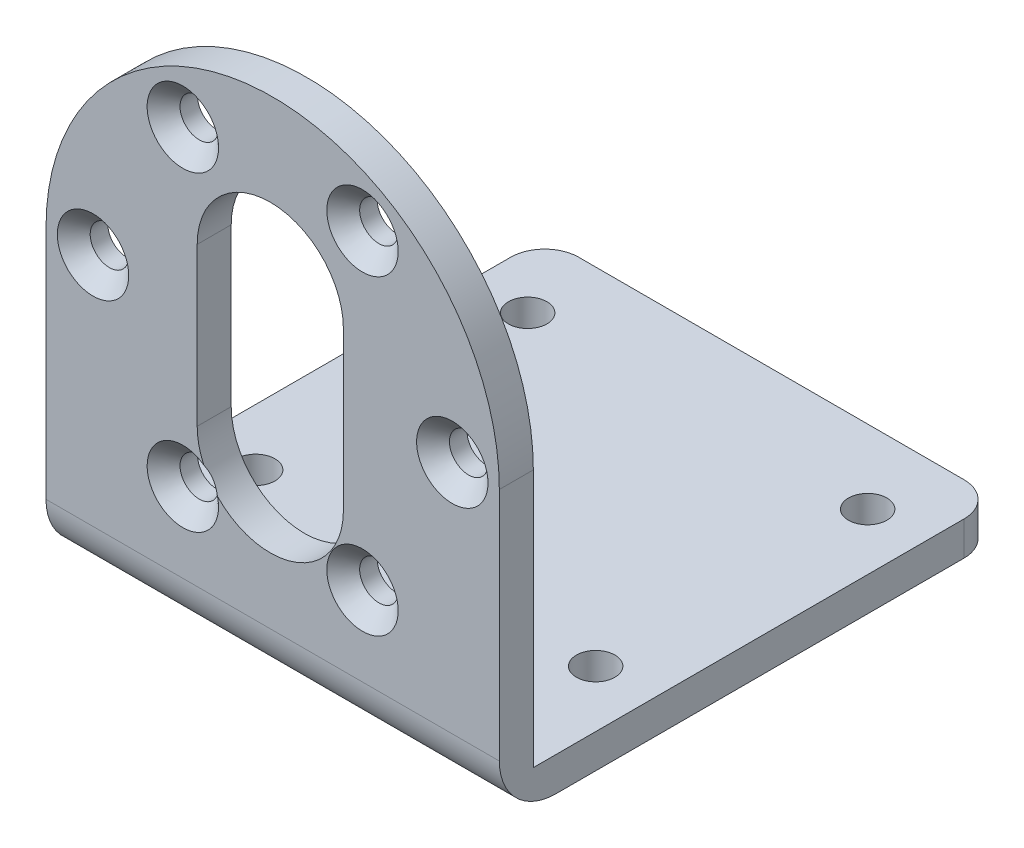
ISO-10303-21;
HEADER;
FILE_DESCRIPTION(('STEP AP214'),'2;1');
FILE_NAME('part.step','',(''),(''),'','','');
FILE_SCHEMA(('AUTOMOTIVE_DESIGN { 1 0 10303 214 1 1 1 1 }'));
ENDSEC;
DATA;
#1=APPLICATION_CONTEXT('core data for automotive mechanical design processes');
#2=APPLICATION_PROTOCOL_DEFINITION('international standard','automotive_design',2000,#1);
#3=PRODUCT_CONTEXT('',#1,'mechanical');
#4=PRODUCT('Part','Part','',(#3));
#5=PRODUCT_RELATED_PRODUCT_CATEGORY('part','',(#4));
#6=PRODUCT_DEFINITION_FORMATION('','',#4);
#7=PRODUCT_DEFINITION_CONTEXT('part definition',#1,'design');
#8=PRODUCT_DEFINITION('design','',#6,#7);
#9=PRODUCT_DEFINITION_SHAPE('','',#8);
#10=(LENGTH_UNIT() NAMED_UNIT(*) SI_UNIT(.MILLI.,.METRE.));
#11=(NAMED_UNIT(*) PLANE_ANGLE_UNIT() SI_UNIT($,.RADIAN.));
#12=(NAMED_UNIT(*) SI_UNIT($,.STERADIAN.) SOLID_ANGLE_UNIT());
#13=UNCERTAINTY_MEASURE_WITH_UNIT(LENGTH_MEASURE(1.E-05),#10,'distance_accuracy_value','');
#14=(GEOMETRIC_REPRESENTATION_CONTEXT(3) GLOBAL_UNCERTAINTY_ASSIGNED_CONTEXT((#13)) GLOBAL_UNIT_ASSIGNED_CONTEXT((#10,
#11,#12)) REPRESENTATION_CONTEXT('',''));
#15=CARTESIAN_POINT('',(0.,0.,0.));
#16=DIRECTION('',(0.,0.,1.));
#17=DIRECTION('',(1.,0.,0.));
#18=AXIS2_PLACEMENT_3D('',#15,#16,#17);
#19=CARTESIAN_POINT('',(20.,25.75,-3.));
#20=DIRECTION('',(0.,0.,1.));
#21=DIRECTION('',(1.,0.,0.));
#22=AXIS2_PLACEMENT_3D('',#19,#20,#21);
#23=PLANE('',#22);
#24=DIRECTION('',(0.,-1.,0.));
#25=VECTOR('',#24,1.);
#26=CARTESIAN_POINT('',(13.3408191826409,31.15,-3.));
#27=LINE('',#26,#25);
#28=CARTESIAN_POINT('',(13.3408191826409,31.15,-3.));
#29=VERTEX_POINT('',#28);
#30=CARTESIAN_POINT('',(13.3408191826409,17.25,-3.));
#31=VERTEX_POINT('',#30);
#32=EDGE_CURVE('E274',#29,#31,#27,.T.);
#33=ORIENTED_EDGE('',*,*,#32,.T.);
#34=CARTESIAN_POINT('',(19.7908191826409,17.25,-3.));
#35=DIRECTION('',(0.,0.,1.));
#36=DIRECTION('',(1.,0.,0.));
#37=AXIS2_PLACEMENT_3D('',#34,#35,#36);
#38=CIRCLE('',#37,6.45);
#39=CARTESIAN_POINT('',(26.2408191826409,17.25,-3.));
#40=VERTEX_POINT('',#39);
#41=EDGE_CURVE('E261',#31,#40,#38,.T.);
#42=ORIENTED_EDGE('',*,*,#41,.T.);
#43=DIRECTION('',(0.,1.,0.));
#44=VECTOR('',#43,1.);
#45=CARTESIAN_POINT('',(26.2408191826409,17.25,-3.));
#46=LINE('',#45,#44);
#47=CARTESIAN_POINT('',(26.2408191826409,31.15,-3.));
#48=VERTEX_POINT('',#47);
#49=EDGE_CURVE('E265',#40,#48,#46,.T.);
#50=ORIENTED_EDGE('',*,*,#49,.T.);
#51=CARTESIAN_POINT('',(19.7908191826409,31.15,-3.));
#52=DIRECTION('',(0.,0.,1.));
#53=DIRECTION('',(1.,0.,0.));
#54=AXIS2_PLACEMENT_3D('',#51,#52,#53);
#55=CIRCLE('',#54,6.45);
#56=EDGE_CURVE('E270',#48,#29,#55,.T.);
#57=ORIENTED_EDGE('',*,*,#56,.T.);
#58=EDGE_LOOP('',(#33,#42,#50,#57));
#59=FACE_BOUND('',#58,.T.);
#60=CARTESIAN_POINT('',(12.0750000000001,12.0234973500166,-3.));
#61=DIRECTION('',(0.,0.,1.));
#62=DIRECTION('',(1.,0.,0.));
#63=AXIS2_PLACEMENT_3D('',#60,#61,#62);
#64=CIRCLE('',#63,1.7);
#65=CARTESIAN_POINT('',(13.7750000000001,12.0234973500166,-3.));
#66=VERTEX_POINT('',#65);
#67=EDGE_CURVE('E256',#66,#66,#64,.T.);
#68=ORIENTED_EDGE('',*,*,#67,.T.);
#69=EDGE_LOOP('',(#68));
#70=FACE_BOUND('',#69,.T.);
#71=CARTESIAN_POINT('',(27.9250000000001,12.0234973500167,-3.));
#72=DIRECTION('',(0.,0.,1.));
#73=DIRECTION('',(1.,0.,0.));
#74=AXIS2_PLACEMENT_3D('',#71,#72,#73);
#75=CIRCLE('',#74,1.7);
#76=CARTESIAN_POINT('',(29.6250000000001,12.0234973500167,-3.));
#77=VERTEX_POINT('',#76);
#78=EDGE_CURVE('E245',#77,#77,#75,.T.);
#79=ORIENTED_EDGE('',*,*,#78,.T.);
#80=EDGE_LOOP('',(#79));
#81=FACE_BOUND('',#80,.T.);
#82=CARTESIAN_POINT('',(35.85,25.7500000000001,-3.));
#83=DIRECTION('',(0.,0.,1.));
#84=DIRECTION('',(1.,0.,0.));
#85=AXIS2_PLACEMENT_3D('',#82,#83,#84);
#86=CIRCLE('',#85,1.7);
#87=CARTESIAN_POINT('',(37.55,25.7500000000001,-3.));
#88=VERTEX_POINT('',#87);
#89=EDGE_CURVE('E233',#88,#88,#86,.T.);
#90=ORIENTED_EDGE('',*,*,#89,.T.);
#91=EDGE_LOOP('',(#90));
#92=FACE_BOUND('',#91,.T.);
#93=CARTESIAN_POINT('',(27.9249999999999,39.4765026499834,-3.));
#94=DIRECTION('',(0.,0.,1.));
#95=DIRECTION('',(1.,0.,0.));
#96=AXIS2_PLACEMENT_3D('',#93,#94,#95);
#97=CIRCLE('',#96,1.7);
#98=CARTESIAN_POINT('',(29.6249999999999,39.4765026499834,-3.));
#99=VERTEX_POINT('',#98);
#100=EDGE_CURVE('E221',#99,#99,#97,.T.);
#101=ORIENTED_EDGE('',*,*,#100,.T.);
#102=EDGE_LOOP('',(#101));
#103=FACE_BOUND('',#102,.T.);
#104=CARTESIAN_POINT('',(12.0749999999999,39.4765026499833,-3.));
#105=DIRECTION('',(0.,0.,1.));
#106=DIRECTION('',(1.,0.,0.));
#107=AXIS2_PLACEMENT_3D('',#104,#105,#106);
#108=CIRCLE('',#107,1.7);
#109=CARTESIAN_POINT('',(13.7749999999999,39.4765026499833,-3.));
#110=VERTEX_POINT('',#109);
#111=EDGE_CURVE('E209',#110,#110,#108,.T.);
#112=ORIENTED_EDGE('',*,*,#111,.T.);
#113=EDGE_LOOP('',(#112));
#114=FACE_BOUND('',#113,.T.);
#115=CARTESIAN_POINT('',(4.15000000000001,25.7499999999999,-3.));
#116=DIRECTION('',(0.,0.,1.));
#117=DIRECTION('',(1.,0.,0.));
#118=AXIS2_PLACEMENT_3D('',#115,#116,#117);
#119=CIRCLE('',#118,1.7);
#120=CARTESIAN_POINT('',(5.85000000000001,25.7499999999999,-3.));
#121=VERTEX_POINT('',#120);
#122=EDGE_CURVE('E197',#121,#121,#119,.T.);
#123=ORIENTED_EDGE('',*,*,#122,.T.);
#124=EDGE_LOOP('',(#123));
#125=FACE_BOUND('',#124,.T.);
#126=DIRECTION('',(1.,0.,0.));
#127=VECTOR('',#126,1.);
#128=CARTESIAN_POINT('',(40.,3.,-3.));
#129=LINE('',#128,#127);
#130=CARTESIAN_POINT('',(0.,3.,-3.));
#131=VERTEX_POINT('',#130);
#132=CARTESIAN_POINT('',(40.,3.,-3.));
#133=VERTEX_POINT('',#132);
#134=EDGE_CURVE('E159',#131,#133,#129,.T.);
#135=ORIENTED_EDGE('',*,*,#134,.F.);
#136=DIRECTION('',(0.,-1.,0.));
#137=VECTOR('',#136,1.);
#138=CARTESIAN_POINT('',(0.,25.75,-3.));
#139=LINE('',#138,#137);
#140=CARTESIAN_POINT('',(0.,25.75,-3.));
#141=VERTEX_POINT('',#140);
#142=EDGE_CURVE('E169',#141,#131,#139,.T.);
#143=ORIENTED_EDGE('',*,*,#142,.F.);
#144=CARTESIAN_POINT('',(20.,25.75,-3.));
#145=DIRECTION('',(0.,0.,1.));
#146=DIRECTION('',(1.,0.,0.));
#147=AXIS2_PLACEMENT_3D('',#144,#145,#146);
#148=CIRCLE('',#147,20.);
#149=CARTESIAN_POINT('',(40.,25.75,-3.));
#150=VERTEX_POINT('',#149);
#151=EDGE_CURVE('E167',#150,#141,#148,.T.);
#152=ORIENTED_EDGE('',*,*,#151,.F.);
#153=DIRECTION('',(0.,1.,0.));
#154=VECTOR('',#153,1.);
#155=CARTESIAN_POINT('',(40.,0.,-3.));
#156=LINE('',#155,#154);
#157=EDGE_CURVE('E151',#133,#150,#156,.T.);
#158=ORIENTED_EDGE('',*,*,#157,.F.);
#159=EDGE_LOOP('',(#135,#143,#152,#158));
#160=FACE_BOUND('',#159,.T.);
#161=ADVANCED_FACE('F46',(#59,#70,#81,#92,#103,#114,#125,#160),#23,.F.);
#162=CARTESIAN_POINT('',(0.,25.75,-3.));
#163=DIRECTION('',(-1.,0.,0.));
#164=DIRECTION('',(0.,-1.,0.));
#165=AXIS2_PLACEMENT_3D('',#162,#163,#164);
#166=PLANE('',#165);
#167=DIRECTION('',(0.,0.,1.));
#168=VECTOR('',#167,1.);
#169=CARTESIAN_POINT('',(0.,0.,-3.));
#170=LINE('',#169,#168);
#171=CARTESIAN_POINT('',(0.,0.,-41.));
#172=VERTEX_POINT('',#171);
#173=CARTESIAN_POINT('',(0.,0.,-5.));
#174=VERTEX_POINT('',#173);
#175=EDGE_CURVE('E312',#172,#174,#170,.T.);
#176=ORIENTED_EDGE('',*,*,#175,.T.);
#177=CARTESIAN_POINT('',(0.,5.,-5.));
#178=DIRECTION('',(-1.,0.,0.));
#179=DIRECTION('',(0.,-1.,0.));
#180=AXIS2_PLACEMENT_3D('',#177,#178,#179);
#181=CIRCLE('',#180,5.);
#182=CARTESIAN_POINT('',(0.,5.,0.));
#183=VERTEX_POINT('',#182);
#184=EDGE_CURVE('E12',#174,#183,#181,.T.);
#185=ORIENTED_EDGE('',*,*,#184,.T.);
#186=DIRECTION('',(0.,-1.,0.));
#187=VECTOR('',#186,1.);
#188=CARTESIAN_POINT('',(0.,25.75,0.));
#189=LINE('',#188,#187);
#190=CARTESIAN_POINT('',(0.,25.75,0.));
#191=VERTEX_POINT('',#190);
#192=EDGE_CURVE('E297',#191,#183,#189,.T.);
#193=ORIENTED_EDGE('',*,*,#192,.F.);
#194=DIRECTION('',(0.,0.,1.));
#195=VECTOR('',#194,1.);
#196=CARTESIAN_POINT('',(0.,25.75,-3.));
#197=LINE('',#196,#195);
#198=EDGE_CURVE('E322',#141,#191,#197,.T.);
#199=ORIENTED_EDGE('',*,*,#198,.F.);
#200=ORIENTED_EDGE('',*,*,#142,.T.);
#201=DIRECTION('',(0.,0.,1.));
#202=VECTOR('',#201,1.);
#203=CARTESIAN_POINT('',(0.,3.,-128.112342240263));
#204=LINE('',#203,#202);
#205=CARTESIAN_POINT('',(0.,3.,-41.));
#206=VERTEX_POINT('',#205);
#207=EDGE_CURVE('E158',#206,#131,#204,.T.);
#208=ORIENTED_EDGE('',*,*,#207,.F.);
#209=DIRECTION('',(0.,-1.,0.));
#210=VECTOR('',#209,1.);
#211=CARTESIAN_POINT('',(0.,0.,-41.));
#212=LINE('',#211,#210);
#213=EDGE_CURVE('E343',#206,#172,#212,.T.);
#214=ORIENTED_EDGE('',*,*,#213,.T.);
#215=EDGE_LOOP('',(#176,#185,#193,#199,#200,#208,#214));
#216=FACE_BOUND('',#215,.T.);
#217=ADVANCED_FACE('F375',(#216),#166,.T.);
#218=CARTESIAN_POINT('',(20.,25.75,-3.));
#219=DIRECTION('',(0.,0.,1.));
#220=DIRECTION('',(1.,0.,0.));
#221=AXIS2_PLACEMENT_3D('',#218,#219,#220);
#222=CYLINDRICAL_SURFACE('',#221,20.);
#223=CARTESIAN_POINT('',(20.,25.75,0.));
#224=DIRECTION('',(0.,0.,1.));
#225=DIRECTION('',(1.,0.,0.));
#226=AXIS2_PLACEMENT_3D('',#223,#224,#225);
#227=CIRCLE('',#226,20.);
#228=CARTESIAN_POINT('',(40.,25.75,0.));
#229=VERTEX_POINT('',#228);
#230=EDGE_CURVE('E308',#229,#191,#227,.T.);
#231=ORIENTED_EDGE('',*,*,#230,.F.);
#232=DIRECTION('',(0.,0.,1.));
#233=VECTOR('',#232,1.);
#234=CARTESIAN_POINT('',(40.,25.75,-3.));
#235=LINE('',#234,#233);
#236=EDGE_CURVE('E326',#150,#229,#235,.T.);
#237=ORIENTED_EDGE('',*,*,#236,.F.);
#238=ORIENTED_EDGE('',*,*,#151,.T.);
#239=ORIENTED_EDGE('',*,*,#198,.T.);
#240=EDGE_LOOP('',(#231,#237,#238,#239));
#241=FACE_BOUND('',#240,.T.);
#242=ADVANCED_FACE('F382',(#241),#222,.T.);
#243=CARTESIAN_POINT('',(40.,0.,-3.));
#244=DIRECTION('',(1.,0.,0.));
#245=DIRECTION('',(0.,1.,0.));
#246=AXIS2_PLACEMENT_3D('',#243,#244,#245);
#247=PLANE('',#246);
#248=DIRECTION('',(0.,1.,0.));
#249=VECTOR('',#248,1.);
#250=CARTESIAN_POINT('',(40.,0.,0.));
#251=LINE('',#250,#249);
#252=CARTESIAN_POINT('',(40.,5.,0.));
#253=VERTEX_POINT('',#252);
#254=EDGE_CURVE('E316',#253,#229,#251,.T.);
#255=ORIENTED_EDGE('',*,*,#254,.F.);
#256=CARTESIAN_POINT('',(40.,5.,-5.));
#257=DIRECTION('',(1.,0.,0.));
#258=DIRECTION('',(0.,1.,0.));
#259=AXIS2_PLACEMENT_3D('',#256,#257,#258);
#260=CIRCLE('',#259,5.);
#261=CARTESIAN_POINT('',(40.,0.,-5.));
#262=VERTEX_POINT('',#261);
#263=EDGE_CURVE('E69',#253,#262,#260,.T.);
#264=ORIENTED_EDGE('',*,*,#263,.T.);
#265=DIRECTION('',(0.,0.,1.));
#266=VECTOR('',#265,1.);
#267=CARTESIAN_POINT('',(40.,0.,-3.));
#268=LINE('',#267,#266);
#269=CARTESIAN_POINT('',(40.,0.,-41.));
#270=VERTEX_POINT('',#269);
#271=EDGE_CURVE('E329',#270,#262,#268,.T.);
#272=ORIENTED_EDGE('',*,*,#271,.F.);
#273=DIRECTION('',(0.,1.,0.));
#274=VECTOR('',#273,1.);
#275=CARTESIAN_POINT('',(40.,3.,-41.));
#276=LINE('',#275,#274);
#277=CARTESIAN_POINT('',(40.,3.,-41.));
#278=VERTEX_POINT('',#277);
#279=EDGE_CURVE('E154',#270,#278,#276,.T.);
#280=ORIENTED_EDGE('',*,*,#279,.T.);
#281=DIRECTION('',(0.,0.,1.));
#282=VECTOR('',#281,1.);
#283=CARTESIAN_POINT('',(40.,3.,-128.112342240263));
#284=LINE('',#283,#282);
#285=EDGE_CURVE('E147',#278,#133,#284,.T.);
#286=ORIENTED_EDGE('',*,*,#285,.T.);
#287=ORIENTED_EDGE('',*,*,#157,.T.);
#288=ORIENTED_EDGE('',*,*,#236,.T.);
#289=EDGE_LOOP('',(#255,#264,#272,#280,#286,#287,#288));
#290=FACE_BOUND('',#289,.T.);
#291=ADVANCED_FACE('F149',(#290),#247,.T.);
#292=CARTESIAN_POINT('',(0.,0.,-3.));
#293=DIRECTION('',(0.,-1.,0.));
#294=DIRECTION('',(0.,0.,-1.));
#295=AXIS2_PLACEMENT_3D('',#292,#293,#294);
#296=PLANE('',#295);
#297=CARTESIAN_POINT('',(35.,0.,-37.5));
#298=DIRECTION('',(0.,-1.,0.));
#299=DIRECTION('',(0.,0.,1.));
#300=AXIS2_PLACEMENT_3D('',#297,#298,#299);
#301=CIRCLE('',#300,1.7);
#302=CARTESIAN_POINT('',(35.,0.,-35.8));
#303=VERTEX_POINT('',#302);
#304=EDGE_CURVE('E719',#303,#303,#301,.T.);
#305=ORIENTED_EDGE('',*,*,#304,.F.);
#306=EDGE_LOOP('',(#305));
#307=FACE_BOUND('',#306,.T.);
#308=CARTESIAN_POINT('',(5.,0.,-13.5));
#309=DIRECTION('',(0.,-1.,0.));
#310=DIRECTION('',(0.,0.,-1.));
#311=AXIS2_PLACEMENT_3D('',#308,#309,#310);
#312=CIRCLE('',#311,1.7);
#313=CARTESIAN_POINT('',(5.,0.,-15.2));
#314=VERTEX_POINT('',#313);
#315=EDGE_CURVE('E726',#314,#314,#312,.T.);
#316=ORIENTED_EDGE('',*,*,#315,.F.);
#317=EDGE_LOOP('',(#316));
#318=FACE_BOUND('',#317,.T.);
#319=CARTESIAN_POINT('',(35.,0.,-13.5));
#320=DIRECTION('',(0.,-1.,0.));
#321=DIRECTION('',(0.,0.,1.));
#322=AXIS2_PLACEMENT_3D('',#319,#320,#321);
#323=CIRCLE('',#322,1.7);
#324=CARTESIAN_POINT('',(35.,0.,-11.8));
#325=VERTEX_POINT('',#324);
#326=EDGE_CURVE('E734',#325,#325,#323,.T.);
#327=ORIENTED_EDGE('',*,*,#326,.F.);
#328=EDGE_LOOP('',(#327));
#329=FACE_BOUND('',#328,.T.);
#330=CARTESIAN_POINT('',(5.,0.,-37.5));
#331=DIRECTION('',(0.,-1.,0.));
#332=DIRECTION('',(0.,0.,-1.));
#333=AXIS2_PLACEMENT_3D('',#330,#331,#332);
#334=CIRCLE('',#333,1.7);
#335=CARTESIAN_POINT('',(5.,0.,-39.2));
#336=VERTEX_POINT('',#335);
#337=EDGE_CURVE('E179',#336,#336,#334,.T.);
#338=ORIENTED_EDGE('',*,*,#337,.F.);
#339=EDGE_LOOP('',(#338));
#340=FACE_BOUND('',#339,.T.);
#341=ORIENTED_EDGE('',*,*,#271,.T.);
#342=DIRECTION('',(1.,0.,0.));
#343=VECTOR('',#342,1.);
#344=CARTESIAN_POINT('',(0.,0.,-5.));
#345=LINE('',#344,#343);
#346=EDGE_CURVE('E55',#262,#174,#345,.F.);
#347=ORIENTED_EDGE('',*,*,#346,.T.);
#348=ORIENTED_EDGE('',*,*,#175,.F.);
#349=CARTESIAN_POINT('',(3.,0.,-41.));
#350=DIRECTION('',(0.,-1.,0.));
#351=DIRECTION('',(0.,0.,-1.));
#352=AXIS2_PLACEMENT_3D('',#349,#350,#351);
#353=CIRCLE('',#352,3.);
#354=CARTESIAN_POINT('',(3.,0.,-44.));
#355=VERTEX_POINT('',#354);
#356=EDGE_CURVE('E417',#172,#355,#353,.T.);
#357=ORIENTED_EDGE('',*,*,#356,.T.);
#358=DIRECTION('',(1.,0.,0.));
#359=VECTOR('',#358,1.);
#360=CARTESIAN_POINT('',(40.,0.,-44.));
#361=LINE('',#360,#359);
#362=CARTESIAN_POINT('',(37.,0.,-44.));
#363=VERTEX_POINT('',#362);
#364=EDGE_CURVE('E182',#355,#363,#361,.T.);
#365=ORIENTED_EDGE('',*,*,#364,.T.);
#366=CARTESIAN_POINT('',(37.,0.,-41.));
#367=DIRECTION('',(0.,-1.,0.));
#368=DIRECTION('',(0.,0.,-1.));
#369=AXIS2_PLACEMENT_3D('',#366,#367,#368);
#370=CIRCLE('',#369,3.);
#371=EDGE_CURVE('E413',#363,#270,#370,.T.);
#372=ORIENTED_EDGE('',*,*,#371,.T.);
#373=EDGE_LOOP('',(#341,#347,#348,#357,#365,#372));
#374=FACE_BOUND('',#373,.T.);
#375=ADVANCED_FACE('F390',(#307,#318,#329,#340,#374),#296,.T.);
#376=CARTESIAN_POINT('',(20.,25.75,0.));
#377=DIRECTION('',(0.,0.,1.));
#378=DIRECTION('',(1.,0.,0.));
#379=AXIS2_PLACEMENT_3D('',#376,#377,#378);
#380=PLANE('',#379);
#381=CARTESIAN_POINT('',(4.15000000000001,25.7499999999999,0.));
#382=DIRECTION('',(0.,0.,1.));
#383=DIRECTION('',(1.,0.,0.));
#384=AXIS2_PLACEMENT_3D('',#381,#382,#383);
#385=CIRCLE('',#384,3.15);
#386=CARTESIAN_POINT('',(7.30000000000001,25.7499999999999,0.));
#387=VERTEX_POINT('',#386);
#388=EDGE_CURVE('E189',#387,#387,#385,.T.);
#389=ORIENTED_EDGE('',*,*,#388,.F.);
#390=EDGE_LOOP('',(#389));
#391=FACE_BOUND('',#390,.T.);
#392=CARTESIAN_POINT('',(12.0749999999999,39.4765026499833,0.));
#393=DIRECTION('',(0.,0.,1.));
#394=DIRECTION('',(1.,0.,0.));
#395=AXIS2_PLACEMENT_3D('',#392,#393,#394);
#396=CIRCLE('',#395,3.15);
#397=CARTESIAN_POINT('',(15.2249999999999,39.4765026499833,0.));
#398=VERTEX_POINT('',#397);
#399=EDGE_CURVE('E201',#398,#398,#396,.T.);
#400=ORIENTED_EDGE('',*,*,#399,.F.);
#401=EDGE_LOOP('',(#400));
#402=FACE_BOUND('',#401,.T.);
#403=CARTESIAN_POINT('',(27.9249999999999,39.4765026499834,0.));
#404=DIRECTION('',(0.,0.,1.));
#405=DIRECTION('',(1.,0.,0.));
#406=AXIS2_PLACEMENT_3D('',#403,#404,#405);
#407=CIRCLE('',#406,3.15);
#408=CARTESIAN_POINT('',(31.0749999999999,39.4765026499834,0.));
#409=VERTEX_POINT('',#408);
#410=EDGE_CURVE('E213',#409,#409,#407,.T.);
#411=ORIENTED_EDGE('',*,*,#410,.F.);
#412=EDGE_LOOP('',(#411));
#413=FACE_BOUND('',#412,.T.);
#414=CARTESIAN_POINT('',(35.85,25.7500000000001,0.));
#415=DIRECTION('',(0.,0.,1.));
#416=DIRECTION('',(1.,0.,0.));
#417=AXIS2_PLACEMENT_3D('',#414,#415,#416);
#418=CIRCLE('',#417,3.15);
#419=CARTESIAN_POINT('',(39.,25.7500000000001,0.));
#420=VERTEX_POINT('',#419);
#421=EDGE_CURVE('E225',#420,#420,#418,.T.);
#422=ORIENTED_EDGE('',*,*,#421,.F.);
#423=EDGE_LOOP('',(#422));
#424=FACE_BOUND('',#423,.T.);
#425=CARTESIAN_POINT('',(27.9250000000001,12.0234973500167,0.));
#426=DIRECTION('',(0.,0.,1.));
#427=DIRECTION('',(1.,0.,0.));
#428=AXIS2_PLACEMENT_3D('',#425,#426,#427);
#429=CIRCLE('',#428,3.15);
#430=CARTESIAN_POINT('',(31.0750000000001,12.0234973500167,0.));
#431=VERTEX_POINT('',#430);
#432=EDGE_CURVE('E237',#431,#431,#429,.T.);
#433=ORIENTED_EDGE('',*,*,#432,.F.);
#434=EDGE_LOOP('',(#433));
#435=FACE_BOUND('',#434,.T.);
#436=CARTESIAN_POINT('',(12.0750000000001,12.0234973500166,0.));
#437=DIRECTION('',(0.,0.,1.));
#438=DIRECTION('',(1.,0.,0.));
#439=AXIS2_PLACEMENT_3D('',#436,#437,#438);
#440=CIRCLE('',#439,3.15);
#441=CARTESIAN_POINT('',(13.9213890722011,14.5756234037328,0.));
#442=VERTEX_POINT('',#441);
#443=CARTESIAN_POINT('',(15.1299614729123,12.7914233874853,0.));
#444=VERTEX_POINT('',#443);
#445=EDGE_CURVE('E249',#442,#444,#440,.T.);
#446=ORIENTED_EDGE('',*,*,#445,.F.);
#447=CARTESIAN_POINT('',(19.7908191826409,17.25,0.));
#448=DIRECTION('',(0.,0.,1.));
#449=DIRECTION('',(1.,0.,0.));
#450=AXIS2_PLACEMENT_3D('',#447,#448,#449);
#451=CIRCLE('',#450,6.45);
#452=CARTESIAN_POINT('',(13.3408191826409,17.25,0.));
#453=VERTEX_POINT('',#452);
#454=EDGE_CURVE('E279',#453,#442,#451,.T.);
#455=ORIENTED_EDGE('',*,*,#454,.F.);
#456=DIRECTION('',(0.,-1.,0.));
#457=VECTOR('',#456,1.);
#458=CARTESIAN_POINT('',(13.3408191826409,31.15,0.));
#459=LINE('',#458,#457);
#460=CARTESIAN_POINT('',(13.3408191826409,31.15,0.));
#461=VERTEX_POINT('',#460);
#462=EDGE_CURVE('E266',#461,#453,#459,.T.);
#463=ORIENTED_EDGE('',*,*,#462,.F.);
#464=CARTESIAN_POINT('',(19.7908191826409,31.15,0.));
#465=DIRECTION('',(0.,0.,1.));
#466=DIRECTION('',(1.,0.,0.));
#467=AXIS2_PLACEMENT_3D('',#464,#465,#466);
#468=CIRCLE('',#467,6.45);
#469=CARTESIAN_POINT('',(26.2408191826409,31.15,0.));
#470=VERTEX_POINT('',#469);
#471=EDGE_CURVE('E287',#470,#461,#468,.T.);
#472=ORIENTED_EDGE('',*,*,#471,.F.);
#473=DIRECTION('',(0.,1.,0.));
#474=VECTOR('',#473,1.);
#475=CARTESIAN_POINT('',(26.2408191826409,17.25,0.));
#476=LINE('',#475,#474);
#477=CARTESIAN_POINT('',(26.2408191826409,17.25,0.));
#478=VERTEX_POINT('',#477);
#479=EDGE_CURVE('E283',#478,#470,#476,.T.);
#480=ORIENTED_EDGE('',*,*,#479,.F.);
#481=EDGE_CURVE('E260',#444,#478,#451,.T.);
#482=ORIENTED_EDGE('',*,*,#481,.F.);
#483=EDGE_LOOP('',(#446,#455,#463,#472,#480,#482));
#484=FACE_BOUND('',#483,.T.);
#485=ORIENTED_EDGE('',*,*,#192,.T.);
#486=DIRECTION('',(1.,0.,0.));
#487=VECTOR('',#486,1.);
#488=CARTESIAN_POINT('',(20.,5.,0.));
#489=LINE('',#488,#487);
#490=EDGE_CURVE('E436',#183,#253,#489,.T.);
#491=ORIENTED_EDGE('',*,*,#490,.T.);
#492=ORIENTED_EDGE('',*,*,#254,.T.);
#493=ORIENTED_EDGE('',*,*,#230,.T.);
#494=EDGE_LOOP('',(#485,#491,#492,#493));
#495=FACE_BOUND('',#494,.T.);
#496=ADVANCED_FACE('F387',(#391,#402,#413,#424,#435,#484,#495),#380,.T.);
#497=CARTESIAN_POINT('',(19.7908191826409,17.25,-3.));
#498=DIRECTION('',(0.,0.,1.));
#499=DIRECTION('',(1.,0.,0.));
#500=AXIS2_PLACEMENT_3D('',#497,#498,#499);
#501=CYLINDRICAL_SURFACE('',#500,6.45);
#502=ORIENTED_EDGE('',*,*,#454,.T.);
#503=CARTESIAN_POINT('',(13.9212213215114,14.5759915952594,0.000200000000079433));
#504=CARTESIAN_POINT('',(13.9504942754342,14.5117338781119,-0.034701605791144));
#505=CARTESIAN_POINT('',(13.9813213568932,14.4468660655974,-0.0674104775400805));
#506=CARTESIAN_POINT('',(14.0463537250341,14.3158930880765,-0.127280501340169));
#507=CARTESIAN_POINT('',(14.0805725938932,14.2497838843547,-0.154417892602636));
#508=CARTESIAN_POINT('',(14.1520184002887,14.1175882471088,-0.201407690485804));
#509=CARTESIAN_POINT('',(14.1892078428061,14.0515096637638,-0.221337420510487));
#510=CARTESIAN_POINT('',(14.2667591434378,13.919368157323,-0.253011512726015));
#511=CARTESIAN_POINT('',(14.3071150595445,13.8533054276769,-0.264770816680965));
#512=CARTESIAN_POINT('',(14.3791831627254,13.7400300864877,-0.277270335988543));
#513=CARTESIAN_POINT('',(14.4102271247902,13.6926210899706,-0.280149258529035));
#514=CARTESIAN_POINT('',(14.4735878008681,13.5985944317818,-0.281037929423633));
#515=CARTESIAN_POINT('',(14.5059047698593,13.5519769313468,-0.279046697376747));
#516=CARTESIAN_POINT('',(14.571542470181,13.4599012210179,-0.270277673776343));
#517=CARTESIAN_POINT('',(14.6048634778569,13.4144433367655,-0.263498552698482));
#518=CARTESIAN_POINT('',(14.6722421823765,13.3249764185879,-0.245442379552396));
#519=CARTESIAN_POINT('',(14.7063001369096,13.2809679054897,-0.234163729278832));
#520=CARTESIAN_POINT('',(14.8045194286997,13.1573412167297,-0.196027865461925));
#521=CARTESIAN_POINT('',(14.8692904492993,13.0797740254809,-0.164126914152014));
#522=CARTESIAN_POINT('',(14.9994971312495,12.9307896264406,-0.0893753783318111));
#523=CARTESIAN_POINT('',(15.0649320627191,12.8593663426912,-0.0465357818622465));
#524=CARTESIAN_POINT('',(15.1302411662492,12.791131023104,0.000200000000079192));
#525=B_SPLINE_CURVE_WITH_KNOTS('',3,(#503,#504,#505,#506,#507,#508,#509,#510,#511,#512,#513,
#514,#515,#516,#517,#518,#519,#520,#521,#522,#523,#524),.UNSPECIFIED.,.F.,.F.,(4,2,2,2,2,2,2,2,
2,2,4),(0.,0.23640822566489,0.473804630315899,0.708572908561388,0.942910713400686,
1.11292105198228,1.28296561781886,1.45305742103308,1.62320969368597,1.94022845180278,
2.25693000387173),.UNSPECIFIED.);
#526=EDGE_CURVE('E325',#442,#444,#525,.T.);
#527=ORIENTED_EDGE('',*,*,#526,.T.);
#528=ORIENTED_EDGE('',*,*,#481,.T.);
#529=DIRECTION('',(0.,0.,1.));
#530=VECTOR('',#529,1.);
#531=CARTESIAN_POINT('',(26.2408191826409,17.25,-3.));
#532=LINE('',#531,#530);
#533=EDGE_CURVE('E278',#40,#478,#532,.T.);
#534=ORIENTED_EDGE('',*,*,#533,.F.);
#535=ORIENTED_EDGE('',*,*,#41,.F.);
#536=DIRECTION('',(0.,0.,1.));
#537=VECTOR('',#536,1.);
#538=CARTESIAN_POINT('',(13.3408191826409,17.25,-3.));
#539=LINE('',#538,#537);
#540=EDGE_CURVE('E294',#31,#453,#539,.T.);
#541=ORIENTED_EDGE('',*,*,#540,.T.);
#542=EDGE_LOOP('',(#502,#527,#528,#534,#535,#541));
#543=FACE_BOUND('',#542,.T.);
#544=ADVANCED_FACE('F345',(#543),#501,.F.);
#545=CARTESIAN_POINT('',(13.3408191826409,31.15,-3.));
#546=DIRECTION('',(-1.,0.,0.));
#547=DIRECTION('',(0.,-1.,0.));
#548=AXIS2_PLACEMENT_3D('',#545,#546,#547);
#549=PLANE('',#548);
#550=ORIENTED_EDGE('',*,*,#462,.T.);
#551=ORIENTED_EDGE('',*,*,#540,.F.);
#552=ORIENTED_EDGE('',*,*,#32,.F.);
#553=DIRECTION('',(0.,0.,1.));
#554=VECTOR('',#553,1.);
#555=CARTESIAN_POINT('',(13.3408191826409,31.15,-3.));
#556=LINE('',#555,#554);
#557=EDGE_CURVE('E298',#29,#461,#556,.T.);
#558=ORIENTED_EDGE('',*,*,#557,.T.);
#559=EDGE_LOOP('',(#550,#551,#552,#558));
#560=FACE_BOUND('',#559,.T.);
#561=ADVANCED_FACE('F362',(#560),#549,.F.);
#562=CARTESIAN_POINT('',(19.7908191826409,31.15,-3.));
#563=DIRECTION('',(0.,0.,1.));
#564=DIRECTION('',(1.,0.,0.));
#565=AXIS2_PLACEMENT_3D('',#562,#563,#564);
#566=CYLINDRICAL_SURFACE('',#565,6.45);
#567=ORIENTED_EDGE('',*,*,#471,.T.);
#568=ORIENTED_EDGE('',*,*,#557,.F.);
#569=ORIENTED_EDGE('',*,*,#56,.F.);
#570=DIRECTION('',(0.,0.,1.));
#571=VECTOR('',#570,1.);
#572=CARTESIAN_POINT('',(26.2408191826409,31.15,-3.));
#573=LINE('',#572,#571);
#574=EDGE_CURVE('E301',#48,#470,#573,.T.);
#575=ORIENTED_EDGE('',*,*,#574,.T.);
#576=EDGE_LOOP('',(#567,#568,#569,#575));
#577=FACE_BOUND('',#576,.T.);
#578=ADVANCED_FACE('F365',(#577),#566,.F.);
#579=CARTESIAN_POINT('',(26.2408191826409,17.25,-3.));
#580=DIRECTION('',(1.,0.,0.));
#581=DIRECTION('',(0.,1.,0.));
#582=AXIS2_PLACEMENT_3D('',#579,#580,#581);
#583=PLANE('',#582);
#584=ORIENTED_EDGE('',*,*,#479,.T.);
#585=ORIENTED_EDGE('',*,*,#574,.F.);
#586=ORIENTED_EDGE('',*,*,#49,.F.);
#587=ORIENTED_EDGE('',*,*,#533,.T.);
#588=EDGE_LOOP('',(#584,#585,#586,#587));
#589=FACE_BOUND('',#588,.T.);
#590=ADVANCED_FACE('F355',(#589),#583,.F.);
#591=CARTESIAN_POINT('',(12.0750000000001,12.0234973500166,0.));
#592=DIRECTION('',(0.,0.,1.));
#593=DIRECTION('',(1.,0.,0.));
#594=AXIS2_PLACEMENT_3D('',#591,#592,#593);
#595=CONICAL_SURFACE('',#594,3.15,0.785398163397449);
#596=CARTESIAN_POINT('',(12.0750000000001,12.0234973500166,-1.45));
#597=DIRECTION('',(0.,0.,1.));
#598=DIRECTION('',(1.,0.,0.));
#599=AXIS2_PLACEMENT_3D('',#596,#597,#598);
#600=CIRCLE('',#599,1.7);
#601=CARTESIAN_POINT('',(13.7750000000001,12.0234973500166,-1.45));
#602=VERTEX_POINT('',#601);
#603=EDGE_CURVE('E252',#602,#602,#600,.T.);
#604=ORIENTED_EDGE('',*,*,#603,.F.);
#605=EDGE_LOOP('',(#604));
#606=FACE_BOUND('',#605,.T.);
#607=ORIENTED_EDGE('',*,*,#445,.T.);
#608=ORIENTED_EDGE('',*,*,#526,.F.);
#609=EDGE_LOOP('',(#607,#608));
#610=FACE_BOUND('',#609,.T.);
#611=ADVANCED_FACE('F349',(#606,#610),#595,.F.);
#612=CARTESIAN_POINT('',(12.0750000000001,12.0234973500166,0.));
#613=DIRECTION('',(0.,0.,1.));
#614=DIRECTION('',(1.,0.,0.));
#615=AXIS2_PLACEMENT_3D('',#612,#613,#614);
#616=CYLINDRICAL_SURFACE('',#615,1.7);
#617=ORIENTED_EDGE('',*,*,#67,.F.);
#618=EDGE_LOOP('',(#617));
#619=FACE_BOUND('',#618,.T.);
#620=ORIENTED_EDGE('',*,*,#603,.T.);
#621=EDGE_LOOP('',(#620));
#622=FACE_BOUND('',#621,.T.);
#623=ADVANCED_FACE('F354',(#619,#622),#616,.F.);
#624=CARTESIAN_POINT('',(27.9250000000001,12.0234973500167,0.));
#625=DIRECTION('',(0.,0.,1.));
#626=DIRECTION('',(1.,0.,0.));
#627=AXIS2_PLACEMENT_3D('',#624,#625,#626);
#628=CYLINDRICAL_SURFACE('',#627,1.7);
#629=ORIENTED_EDGE('',*,*,#78,.F.);
#630=EDGE_LOOP('',(#629));
#631=FACE_BOUND('',#630,.T.);
#632=CARTESIAN_POINT('',(27.9250000000001,12.0234973500167,-1.45));
#633=DIRECTION('',(0.,0.,1.));
#634=DIRECTION('',(1.,0.,0.));
#635=AXIS2_PLACEMENT_3D('',#632,#633,#634);
#636=CIRCLE('',#635,1.7);
#637=CARTESIAN_POINT('',(29.6250000000001,12.0234973500167,-1.45));
#638=VERTEX_POINT('',#637);
#639=EDGE_CURVE('E241',#638,#638,#636,.T.);
#640=ORIENTED_EDGE('',*,*,#639,.T.);
#641=EDGE_LOOP('',(#640));
#642=FACE_BOUND('',#641,.T.);
#643=ADVANCED_FACE('F357',(#631,#642),#628,.F.);
#644=CARTESIAN_POINT('',(27.9250000000001,12.0234973500167,0.));
#645=DIRECTION('',(0.,0.,1.));
#646=DIRECTION('',(1.,0.,0.));
#647=AXIS2_PLACEMENT_3D('',#644,#645,#646);
#648=CONICAL_SURFACE('',#647,3.15,0.785398163397449);
#649=ORIENTED_EDGE('',*,*,#639,.F.);
#650=EDGE_LOOP('',(#649));
#651=FACE_BOUND('',#650,.T.);
#652=ORIENTED_EDGE('',*,*,#432,.T.);
#653=EDGE_LOOP('',(#652));
#654=FACE_BOUND('',#653,.T.);
#655=ADVANCED_FACE('F490',(#651,#654),#648,.F.);
#656=CARTESIAN_POINT('',(35.85,25.7500000000001,0.));
#657=DIRECTION('',(0.,0.,1.));
#658=DIRECTION('',(1.,0.,0.));
#659=AXIS2_PLACEMENT_3D('',#656,#657,#658);
#660=CYLINDRICAL_SURFACE('',#659,1.7);
#661=ORIENTED_EDGE('',*,*,#89,.F.);
#662=EDGE_LOOP('',(#661));
#663=FACE_BOUND('',#662,.T.);
#664=CARTESIAN_POINT('',(35.85,25.7500000000001,-1.45));
#665=DIRECTION('',(0.,0.,1.));
#666=DIRECTION('',(1.,0.,0.));
#667=AXIS2_PLACEMENT_3D('',#664,#665,#666);
#668=CIRCLE('',#667,1.7);
#669=CARTESIAN_POINT('',(37.55,25.7500000000001,-1.45));
#670=VERTEX_POINT('',#669);
#671=EDGE_CURVE('E229',#670,#670,#668,.T.);
#672=ORIENTED_EDGE('',*,*,#671,.T.);
#673=EDGE_LOOP('',(#672));
#674=FACE_BOUND('',#673,.T.);
#675=ADVANCED_FACE('F498',(#663,#674),#660,.F.);
#676=CARTESIAN_POINT('',(35.85,25.7500000000001,0.));
#677=DIRECTION('',(0.,0.,1.));
#678=DIRECTION('',(1.,0.,0.));
#679=AXIS2_PLACEMENT_3D('',#676,#677,#678);
#680=CONICAL_SURFACE('',#679,3.15,0.785398163397449);
#681=ORIENTED_EDGE('',*,*,#671,.F.);
#682=EDGE_LOOP('',(#681));
#683=FACE_BOUND('',#682,.T.);
#684=ORIENTED_EDGE('',*,*,#421,.T.);
#685=EDGE_LOOP('',(#684));
#686=FACE_BOUND('',#685,.T.);
#687=ADVANCED_FACE('F506',(#683,#686),#680,.F.);
#688=CARTESIAN_POINT('',(27.9249999999999,39.4765026499834,0.));
#689=DIRECTION('',(0.,0.,1.));
#690=DIRECTION('',(1.,0.,0.));
#691=AXIS2_PLACEMENT_3D('',#688,#689,#690);
#692=CYLINDRICAL_SURFACE('',#691,1.7);
#693=ORIENTED_EDGE('',*,*,#100,.F.);
#694=EDGE_LOOP('',(#693));
#695=FACE_BOUND('',#694,.T.);
#696=CARTESIAN_POINT('',(27.9249999999999,39.4765026499834,-1.45));
#697=DIRECTION('',(0.,0.,1.));
#698=DIRECTION('',(1.,0.,0.));
#699=AXIS2_PLACEMENT_3D('',#696,#697,#698);
#700=CIRCLE('',#699,1.7);
#701=CARTESIAN_POINT('',(29.6249999999999,39.4765026499834,-1.45));
#702=VERTEX_POINT('',#701);
#703=EDGE_CURVE('E217',#702,#702,#700,.T.);
#704=ORIENTED_EDGE('',*,*,#703,.T.);
#705=EDGE_LOOP('',(#704));
#706=FACE_BOUND('',#705,.T.);
#707=ADVANCED_FACE('F515',(#695,#706),#692,.F.);
#708=CARTESIAN_POINT('',(27.9249999999999,39.4765026499834,0.));
#709=DIRECTION('',(0.,0.,1.));
#710=DIRECTION('',(1.,0.,0.));
#711=AXIS2_PLACEMENT_3D('',#708,#709,#710);
#712=CONICAL_SURFACE('',#711,3.15,0.785398163397449);
#713=ORIENTED_EDGE('',*,*,#703,.F.);
#714=EDGE_LOOP('',(#713));
#715=FACE_BOUND('',#714,.T.);
#716=ORIENTED_EDGE('',*,*,#410,.T.);
#717=EDGE_LOOP('',(#716));
#718=FACE_BOUND('',#717,.T.);
#719=ADVANCED_FACE('F524',(#715,#718),#712,.F.);
#720=CARTESIAN_POINT('',(12.0749999999999,39.4765026499833,0.));
#721=DIRECTION('',(0.,0.,1.));
#722=DIRECTION('',(1.,0.,0.));
#723=AXIS2_PLACEMENT_3D('',#720,#721,#722);
#724=CYLINDRICAL_SURFACE('',#723,1.7);
#725=ORIENTED_EDGE('',*,*,#111,.F.);
#726=EDGE_LOOP('',(#725));
#727=FACE_BOUND('',#726,.T.);
#728=CARTESIAN_POINT('',(12.0749999999999,39.4765026499833,-1.45));
#729=DIRECTION('',(0.,0.,1.));
#730=DIRECTION('',(1.,0.,0.));
#731=AXIS2_PLACEMENT_3D('',#728,#729,#730);
#732=CIRCLE('',#731,1.7);
#733=CARTESIAN_POINT('',(13.7749999999999,39.4765026499833,-1.45));
#734=VERTEX_POINT('',#733);
#735=EDGE_CURVE('E205',#734,#734,#732,.T.);
#736=ORIENTED_EDGE('',*,*,#735,.T.);
#737=EDGE_LOOP('',(#736));
#738=FACE_BOUND('',#737,.T.);
#739=ADVANCED_FACE('F533',(#727,#738),#724,.F.);
#740=CARTESIAN_POINT('',(12.0749999999999,39.4765026499833,0.));
#741=DIRECTION('',(0.,0.,1.));
#742=DIRECTION('',(1.,0.,0.));
#743=AXIS2_PLACEMENT_3D('',#740,#741,#742);
#744=CONICAL_SURFACE('',#743,3.15,0.785398163397449);
#745=ORIENTED_EDGE('',*,*,#735,.F.);
#746=EDGE_LOOP('',(#745));
#747=FACE_BOUND('',#746,.T.);
#748=ORIENTED_EDGE('',*,*,#399,.T.);
#749=EDGE_LOOP('',(#748));
#750=FACE_BOUND('',#749,.T.);
#751=ADVANCED_FACE('F542',(#747,#750),#744,.F.);
#752=CARTESIAN_POINT('',(4.15000000000001,25.7499999999999,0.));
#753=DIRECTION('',(0.,0.,1.));
#754=DIRECTION('',(1.,0.,0.));
#755=AXIS2_PLACEMENT_3D('',#752,#753,#754);
#756=CYLINDRICAL_SURFACE('',#755,1.7);
#757=ORIENTED_EDGE('',*,*,#122,.F.);
#758=EDGE_LOOP('',(#757));
#759=FACE_BOUND('',#758,.T.);
#760=CARTESIAN_POINT('',(4.15000000000001,25.7499999999999,-1.45));
#761=DIRECTION('',(0.,0.,1.));
#762=DIRECTION('',(1.,0.,0.));
#763=AXIS2_PLACEMENT_3D('',#760,#761,#762);
#764=CIRCLE('',#763,1.7);
#765=CARTESIAN_POINT('',(5.85000000000001,25.7499999999999,-1.45));
#766=VERTEX_POINT('',#765);
#767=EDGE_CURVE('E193',#766,#766,#764,.T.);
#768=ORIENTED_EDGE('',*,*,#767,.T.);
#769=EDGE_LOOP('',(#768));
#770=FACE_BOUND('',#769,.T.);
#771=ADVANCED_FACE('F551',(#759,#770),#756,.F.);
#772=CARTESIAN_POINT('',(4.15000000000001,25.7499999999999,0.));
#773=DIRECTION('',(0.,0.,1.));
#774=DIRECTION('',(1.,0.,0.));
#775=AXIS2_PLACEMENT_3D('',#772,#773,#774);
#776=CONICAL_SURFACE('',#775,3.15,0.785398163397449);
#777=ORIENTED_EDGE('',*,*,#767,.F.);
#778=EDGE_LOOP('',(#777));
#779=FACE_BOUND('',#778,.T.);
#780=ORIENTED_EDGE('',*,*,#388,.T.);
#781=EDGE_LOOP('',(#780));
#782=FACE_BOUND('',#781,.T.);
#783=ADVANCED_FACE('F559',(#779,#782),#776,.F.);
#784=CARTESIAN_POINT('',(40.,3.,-128.112342240263));
#785=DIRECTION('',(0.,-1.,0.));
#786=DIRECTION('',(0.,0.,-1.));
#787=AXIS2_PLACEMENT_3D('',#784,#785,#786);
#788=PLANE('',#787);
#789=CARTESIAN_POINT('',(35.,3.,-37.5));
#790=DIRECTION('',(0.,-1.,0.));
#791=DIRECTION('',(0.,0.,-1.));
#792=AXIS2_PLACEMENT_3D('',#789,#790,#791);
#793=CIRCLE('',#792,1.7);
#794=CARTESIAN_POINT('',(35.,3.,-39.2));
#795=VERTEX_POINT('',#794);
#796=EDGE_CURVE('E716',#795,#795,#793,.F.);
#797=ORIENTED_EDGE('',*,*,#796,.F.);
#798=EDGE_LOOP('',(#797));
#799=FACE_BOUND('',#798,.T.);
#800=CARTESIAN_POINT('',(5.,3.,-13.5));
#801=DIRECTION('',(0.,-1.,0.));
#802=DIRECTION('',(0.,0.,-1.));
#803=AXIS2_PLACEMENT_3D('',#800,#801,#802);
#804=CIRCLE('',#803,1.7);
#805=CARTESIAN_POINT('',(5.,3.,-15.2));
#806=VERTEX_POINT('',#805);
#807=EDGE_CURVE('E730',#806,#806,#804,.F.);
#808=ORIENTED_EDGE('',*,*,#807,.F.);
#809=EDGE_LOOP('',(#808));
#810=FACE_BOUND('',#809,.T.);
#811=CARTESIAN_POINT('',(35.,3.,-13.5));
#812=DIRECTION('',(0.,-1.,0.));
#813=DIRECTION('',(0.,0.,-1.));
#814=AXIS2_PLACEMENT_3D('',#811,#812,#813);
#815=CIRCLE('',#814,1.7);
#816=CARTESIAN_POINT('',(35.,3.,-15.2));
#817=VERTEX_POINT('',#816);
#818=EDGE_CURVE('E748',#817,#817,#815,.F.);
#819=ORIENTED_EDGE('',*,*,#818,.F.);
#820=EDGE_LOOP('',(#819));
#821=FACE_BOUND('',#820,.T.);
#822=CARTESIAN_POINT('',(5.,3.,-37.5));
#823=DIRECTION('',(0.,-1.,0.));
#824=DIRECTION('',(0.,0.,-1.));
#825=AXIS2_PLACEMENT_3D('',#822,#823,#824);
#826=CIRCLE('',#825,1.7);
#827=CARTESIAN_POINT('',(5.,3.,-39.2));
#828=VERTEX_POINT('',#827);
#829=EDGE_CURVE('E175',#828,#828,#826,.F.);
#830=ORIENTED_EDGE('',*,*,#829,.F.);
#831=EDGE_LOOP('',(#830));
#832=FACE_BOUND('',#831,.T.);
#833=DIRECTION('',(-1.,0.,0.));
#834=VECTOR('',#833,1.);
#835=CARTESIAN_POINT('',(40.,3.,-44.));
#836=LINE('',#835,#834);
#837=CARTESIAN_POINT('',(37.,3.,-44.));
#838=VERTEX_POINT('',#837);
#839=CARTESIAN_POINT('',(3.,3.,-44.));
#840=VERTEX_POINT('',#839);
#841=EDGE_CURVE('E186',#838,#840,#836,.T.);
#842=ORIENTED_EDGE('',*,*,#841,.T.);
#843=CARTESIAN_POINT('',(3.,3.,-41.));
#844=DIRECTION('',(0.,-1.,0.));
#845=DIRECTION('',(0.,0.,-1.));
#846=AXIS2_PLACEMENT_3D('',#843,#844,#845);
#847=CIRCLE('',#846,3.);
#848=EDGE_CURVE('E431',#840,#206,#847,.F.);
#849=ORIENTED_EDGE('',*,*,#848,.T.);
#850=ORIENTED_EDGE('',*,*,#207,.T.);
#851=ORIENTED_EDGE('',*,*,#134,.T.);
#852=ORIENTED_EDGE('',*,*,#285,.F.);
#853=CARTESIAN_POINT('',(37.,3.,-41.));
#854=DIRECTION('',(0.,-1.,0.));
#855=DIRECTION('',(0.,0.,-1.));
#856=AXIS2_PLACEMENT_3D('',#853,#854,#855);
#857=CIRCLE('',#856,3.);
#858=EDGE_CURVE('E428',#278,#838,#857,.F.);
#859=ORIENTED_EDGE('',*,*,#858,.T.);
#860=EDGE_LOOP('',(#842,#849,#850,#851,#852,#859));
#861=FACE_BOUND('',#860,.T.);
#862=ADVANCED_FACE('F172',(#799,#810,#821,#832,#861),#788,.F.);
#863=CARTESIAN_POINT('',(20.,25.75,-44.));
#864=DIRECTION('',(0.,0.,1.));
#865=DIRECTION('',(1.,0.,0.));
#866=AXIS2_PLACEMENT_3D('',#863,#864,#865);
#867=PLANE('',#866);
#868=ORIENTED_EDGE('',*,*,#364,.F.);
#869=DIRECTION('',(0.,-1.,0.));
#870=VECTOR('',#869,1.);
#871=CARTESIAN_POINT('',(3.,3.,-44.));
#872=LINE('',#871,#870);
#873=EDGE_CURVE('E425',#355,#840,#872,.F.);
#874=ORIENTED_EDGE('',*,*,#873,.T.);
#875=ORIENTED_EDGE('',*,*,#841,.F.);
#876=DIRECTION('',(0.,1.,0.));
#877=VECTOR('',#876,1.);
#878=CARTESIAN_POINT('',(37.,0.,-44.));
#879=LINE('',#878,#877);
#880=EDGE_CURVE('E414',#838,#363,#879,.F.);
#881=ORIENTED_EDGE('',*,*,#880,.T.);
#882=EDGE_LOOP('',(#868,#874,#875,#881));
#883=FACE_BOUND('',#882,.T.);
#884=ADVANCED_FACE('F451',(#883),#867,.F.);
#885=CARTESIAN_POINT('',(5.,7.80832611206852,-37.5));
#886=DIRECTION('',(0.,-1.,0.));
#887=DIRECTION('',(0.,0.,-1.));
#888=AXIS2_PLACEMENT_3D('',#885,#886,#887);
#889=CYLINDRICAL_SURFACE('',#888,1.7);
#890=ORIENTED_EDGE('',*,*,#829,.T.);
#891=EDGE_LOOP('',(#890));
#892=FACE_BOUND('',#891,.T.);
#893=ORIENTED_EDGE('',*,*,#337,.T.);
#894=EDGE_LOOP('',(#893));
#895=FACE_BOUND('',#894,.T.);
#896=ADVANCED_FACE('F618',(#892,#895),#889,.F.);
#897=CARTESIAN_POINT('',(35.,7.80832611206852,-13.5));
#898=DIRECTION('',(0.,-1.,0.));
#899=DIRECTION('',(0.,0.,-1.));
#900=AXIS2_PLACEMENT_3D('',#897,#898,#899);
#901=CYLINDRICAL_SURFACE('',#900,1.7);
#902=ORIENTED_EDGE('',*,*,#818,.T.);
#903=EDGE_LOOP('',(#902));
#904=FACE_BOUND('',#903,.T.);
#905=ORIENTED_EDGE('',*,*,#326,.T.);
#906=EDGE_LOOP('',(#905));
#907=FACE_BOUND('',#906,.T.);
#908=ADVANCED_FACE('F626',(#904,#907),#901,.F.);
#909=CARTESIAN_POINT('',(5.,7.80832611206852,-13.5));
#910=DIRECTION('',(0.,-1.,0.));
#911=DIRECTION('',(0.,0.,-1.));
#912=AXIS2_PLACEMENT_3D('',#909,#910,#911);
#913=CYLINDRICAL_SURFACE('',#912,1.7);
#914=ORIENTED_EDGE('',*,*,#807,.T.);
#915=EDGE_LOOP('',(#914));
#916=FACE_BOUND('',#915,.T.);
#917=ORIENTED_EDGE('',*,*,#315,.T.);
#918=EDGE_LOOP('',(#917));
#919=FACE_BOUND('',#918,.T.);
#920=ADVANCED_FACE('F636',(#916,#919),#913,.F.);
#921=CARTESIAN_POINT('',(35.,7.80832611206852,-37.5));
#922=DIRECTION('',(0.,-1.,0.));
#923=DIRECTION('',(0.,0.,-1.));
#924=AXIS2_PLACEMENT_3D('',#921,#922,#923);
#925=CYLINDRICAL_SURFACE('',#924,1.7);
#926=ORIENTED_EDGE('',*,*,#796,.T.);
#927=EDGE_LOOP('',(#926));
#928=FACE_BOUND('',#927,.T.);
#929=ORIENTED_EDGE('',*,*,#304,.T.);
#930=EDGE_LOOP('',(#929));
#931=FACE_BOUND('',#930,.T.);
#932=ADVANCED_FACE('F403',(#928,#931),#925,.F.);
#933=CARTESIAN_POINT('',(3.00000000000001,25.75,-41.));
#934=DIRECTION('',(0.,1.,0.));
#935=DIRECTION('',(-1.,0.,0.));
#936=AXIS2_PLACEMENT_3D('',#933,#934,#935);
#937=CYLINDRICAL_SURFACE('',#936,3.);
#938=ORIENTED_EDGE('',*,*,#848,.F.);
#939=ORIENTED_EDGE('',*,*,#873,.F.);
#940=ORIENTED_EDGE('',*,*,#356,.F.);
#941=ORIENTED_EDGE('',*,*,#213,.F.);
#942=EDGE_LOOP('',(#938,#939,#940,#941));
#943=FACE_BOUND('',#942,.T.);
#944=ADVANCED_FACE('F400',(#943),#937,.T.);
#945=CARTESIAN_POINT('',(37.,0.,-41.));
#946=DIRECTION('',(0.,-1.,0.));
#947=DIRECTION('',(1.,0.,0.));
#948=AXIS2_PLACEMENT_3D('',#945,#946,#947);
#949=CYLINDRICAL_SURFACE('',#948,3.);
#950=ORIENTED_EDGE('',*,*,#371,.F.);
#951=ORIENTED_EDGE('',*,*,#880,.F.);
#952=ORIENTED_EDGE('',*,*,#858,.F.);
#953=ORIENTED_EDGE('',*,*,#279,.F.);
#954=EDGE_LOOP('',(#950,#951,#952,#953));
#955=FACE_BOUND('',#954,.T.);
#956=ADVANCED_FACE('F402',(#955),#949,.T.);
#957=CARTESIAN_POINT('',(20.,5.,-5.));
#958=DIRECTION('',(1.,0.,0.));
#959=DIRECTION('',(0.,0.,-1.));
#960=AXIS2_PLACEMENT_3D('',#957,#958,#959);
#961=CYLINDRICAL_SURFACE('',#960,5.);
#962=ORIENTED_EDGE('',*,*,#184,.F.);
#963=ORIENTED_EDGE('',*,*,#346,.F.);
#964=ORIENTED_EDGE('',*,*,#263,.F.);
#965=ORIENTED_EDGE('',*,*,#490,.F.);
#966=EDGE_LOOP('',(#962,#963,#964,#965));
#967=FACE_BOUND('',#966,.T.);
#968=ADVANCED_FACE('F48',(#967),#961,.T.);
#969=CLOSED_SHELL('',(#161,#217,#242,#291,#375,#496,#544,#561,#578,#590,#611,#623,#643,#655,
#675,#687,#707,#719,#739,#751,#771,#783,#862,#884,#896,#908,#920,#932,#944,#956,#968));
#970=MANIFOLD_SOLID_BREP('B2',#969);
#971=ADVANCED_BREP_SHAPE_REPRESENTATION('',(#18,#970),#14);
#972=SHAPE_DEFINITION_REPRESENTATION(#9,#971);
ENDSEC;
END-ISO-10303-21;
